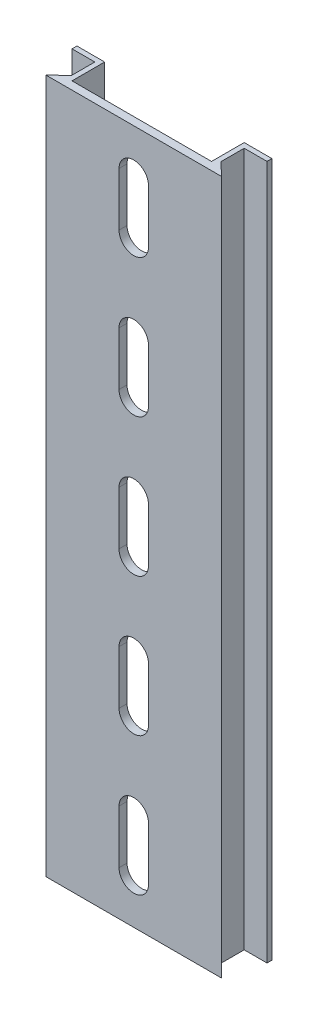
ISO-10303-21;
HEADER;
FILE_DESCRIPTION(('STEP AP214'),'2;1');
FILE_NAME('part.step','',(''),(''),'','','');
FILE_SCHEMA(('AUTOMOTIVE_DESIGN { 1 0 10303 214 1 1 1 1 }'));
ENDSEC;
DATA;
#1=APPLICATION_CONTEXT('core data for automotive mechanical design processes');
#2=APPLICATION_PROTOCOL_DEFINITION('international standard','automotive_design',2000,#1);
#3=PRODUCT_CONTEXT('',#1,'mechanical');
#4=PRODUCT('Part','Part','',(#3));
#5=PRODUCT_RELATED_PRODUCT_CATEGORY('part','',(#4));
#6=PRODUCT_DEFINITION_FORMATION('','',#4);
#7=PRODUCT_DEFINITION_CONTEXT('part definition',#1,'design');
#8=PRODUCT_DEFINITION('design','',#6,#7);
#9=PRODUCT_DEFINITION_SHAPE('','',#8);
#10=(LENGTH_UNIT() NAMED_UNIT(*) SI_UNIT(.MILLI.,.METRE.));
#11=(NAMED_UNIT(*) PLANE_ANGLE_UNIT() SI_UNIT($,.RADIAN.));
#12=(NAMED_UNIT(*) SI_UNIT($,.STERADIAN.) SOLID_ANGLE_UNIT());
#13=UNCERTAINTY_MEASURE_WITH_UNIT(LENGTH_MEASURE(1.E-05),#10,'distance_accuracy_value','');
#14=(GEOMETRIC_REPRESENTATION_CONTEXT(3) GLOBAL_UNCERTAINTY_ASSIGNED_CONTEXT((#13)) GLOBAL_UNIT_ASSIGNED_CONTEXT((#10,
#11,#12)) REPRESENTATION_CONTEXT('',''));
#15=CARTESIAN_POINT('',(0.,0.,0.));
#16=DIRECTION('',(0.,0.,1.));
#17=DIRECTION('',(1.,0.,0.));
#18=AXIS2_PLACEMENT_3D('',#15,#16,#17);
#19=CARTESIAN_POINT('',(0.,62.865,-1.4478));
#20=DIRECTION('',(0.,0.,-1.));
#21=DIRECTION('',(-1.,0.,0.));
#22=AXIS2_PLACEMENT_3D('',#19,#20,#21);
#23=PLANE('',#22);
#24=CARTESIAN_POINT('',(0.,20.167,-1.4478));
#25=DIRECTION('',(0.,0.,-1.));
#26=DIRECTION('',(-1.,0.,0.));
#27=AXIS2_PLACEMENT_3D('',#24,#25,#26);
#28=CIRCLE('',#27,2.667);
#29=CARTESIAN_POINT('',(2.66699999999991,20.167,-1.4478));
#30=VERTEX_POINT('',#29);
#31=CARTESIAN_POINT('',(-2.66700000000009,20.167,-1.4478));
#32=VERTEX_POINT('',#31);
#33=EDGE_CURVE('E372',#30,#32,#28,.T.);
#34=ORIENTED_EDGE('',*,*,#33,.F.);
#35=DIRECTION('',(0.,-1.,0.));
#36=VECTOR('',#35,1.);
#37=CARTESIAN_POINT('',(2.66699999999991,62.865,-1.4478));
#38=LINE('',#37,#36);
#39=CARTESIAN_POINT('',(2.66699999999991,29.833,-1.4478));
#40=VERTEX_POINT('',#39);
#41=EDGE_CURVE('E367',#40,#30,#38,.T.);
#42=ORIENTED_EDGE('',*,*,#41,.F.);
#43=CARTESIAN_POINT('',(0.,29.833,-1.4478));
#44=DIRECTION('',(0.,0.,-1.));
#45=DIRECTION('',(-1.,0.,0.));
#46=AXIS2_PLACEMENT_3D('',#43,#44,#45);
#47=CIRCLE('',#46,2.667);
#48=CARTESIAN_POINT('',(-2.66700000000009,29.833,-1.4478));
#49=VERTEX_POINT('',#48);
#50=EDGE_CURVE('E257',#49,#40,#47,.T.);
#51=ORIENTED_EDGE('',*,*,#50,.F.);
#52=DIRECTION('',(0.,1.,0.));
#53=VECTOR('',#52,1.);
#54=CARTESIAN_POINT('',(-2.66700000000009,62.865,-1.4478));
#55=LINE('',#54,#53);
#56=EDGE_CURVE('E370',#32,#49,#55,.T.);
#57=ORIENTED_EDGE('',*,*,#56,.F.);
#58=EDGE_LOOP('',(#34,#42,#51,#57));
#59=FACE_BOUND('',#58,.T.);
#60=CARTESIAN_POINT('',(-1.74574066942157E-13,45.167,-1.4478));
#61=DIRECTION('',(0.,0.,-1.));
#62=DIRECTION('',(-1.,0.,0.));
#63=AXIS2_PLACEMENT_3D('',#60,#61,#62);
#64=CIRCLE('',#63,2.667);
#65=CARTESIAN_POINT('',(2.66699999999982,45.167,-1.4478));
#66=VERTEX_POINT('',#65);
#67=CARTESIAN_POINT('',(-2.66700000000017,45.167,-1.4478));
#68=VERTEX_POINT('',#67);
#69=EDGE_CURVE('E365',#66,#68,#64,.T.);
#70=ORIENTED_EDGE('',*,*,#69,.F.);
#71=DIRECTION('',(0.,-1.,0.));
#72=VECTOR('',#71,1.);
#73=CARTESIAN_POINT('',(2.66699999999982,62.865,-1.4478));
#74=LINE('',#73,#72);
#75=CARTESIAN_POINT('',(2.66699999999982,54.833,-1.4478));
#76=VERTEX_POINT('',#75);
#77=EDGE_CURVE('E359',#76,#66,#74,.T.);
#78=ORIENTED_EDGE('',*,*,#77,.F.);
#79=CARTESIAN_POINT('',(-1.74574066942157E-13,54.833,-1.4478));
#80=DIRECTION('',(0.,0.,-1.));
#81=DIRECTION('',(-1.,0.,0.));
#82=AXIS2_PLACEMENT_3D('',#79,#80,#81);
#83=CIRCLE('',#82,2.667);
#84=CARTESIAN_POINT('',(-2.66700000000017,54.833,-1.4478));
#85=VERTEX_POINT('',#84);
#86=EDGE_CURVE('E361',#85,#76,#83,.T.);
#87=ORIENTED_EDGE('',*,*,#86,.F.);
#88=DIRECTION('',(0.,1.,0.));
#89=VECTOR('',#88,1.);
#90=CARTESIAN_POINT('',(-2.66700000000017,62.865,-1.4478));
#91=LINE('',#90,#89);
#92=EDGE_CURVE('E363',#68,#85,#91,.T.);
#93=ORIENTED_EDGE('',*,*,#92,.F.);
#94=EDGE_LOOP('',(#70,#78,#87,#93));
#95=FACE_BOUND('',#94,.T.);
#96=CARTESIAN_POINT('',(2.61861100413235E-13,-29.833,-1.4478));
#97=DIRECTION('',(0.,0.,-1.));
#98=DIRECTION('',(-1.,0.,0.));
#99=AXIS2_PLACEMENT_3D('',#96,#97,#98);
#100=CIRCLE('',#99,2.667);
#101=CARTESIAN_POINT('',(2.66700000000026,-29.833,-1.4478));
#102=VERTEX_POINT('',#101);
#103=CARTESIAN_POINT('',(-2.66699999999974,-29.833,-1.4478));
#104=VERTEX_POINT('',#103);
#105=EDGE_CURVE('E357',#102,#104,#100,.T.);
#106=ORIENTED_EDGE('',*,*,#105,.F.);
#107=DIRECTION('',(0.,-1.,0.));
#108=VECTOR('',#107,1.);
#109=CARTESIAN_POINT('',(2.66700000000026,62.865,-1.4478));
#110=LINE('',#109,#108);
#111=CARTESIAN_POINT('',(2.66700000000026,-20.167,-1.4478));
#112=VERTEX_POINT('',#111);
#113=EDGE_CURVE('E350',#112,#102,#110,.T.);
#114=ORIENTED_EDGE('',*,*,#113,.F.);
#115=CARTESIAN_POINT('',(2.61861100413235E-13,-20.167,-1.4478));
#116=DIRECTION('',(0.,0.,-1.));
#117=DIRECTION('',(-1.,0.,0.));
#118=AXIS2_PLACEMENT_3D('',#115,#116,#117);
#119=CIRCLE('',#118,2.667);
#120=CARTESIAN_POINT('',(-2.66699999999974,-20.167,-1.4478));
#121=VERTEX_POINT('',#120);
#122=EDGE_CURVE('E352',#121,#112,#119,.T.);
#123=ORIENTED_EDGE('',*,*,#122,.F.);
#124=DIRECTION('',(0.,1.,0.));
#125=VECTOR('',#124,1.);
#126=CARTESIAN_POINT('',(-2.66699999999974,62.865,-1.4478));
#127=LINE('',#126,#125);
#128=EDGE_CURVE('E355',#104,#121,#127,.T.);
#129=ORIENTED_EDGE('',*,*,#128,.F.);
#130=EDGE_LOOP('',(#106,#114,#123,#129));
#131=FACE_BOUND('',#130,.T.);
#132=CARTESIAN_POINT('',(5.2372220082647E-13,-54.833,-1.4478));
#133=DIRECTION('',(0.,0.,-1.));
#134=DIRECTION('',(-1.,0.,0.));
#135=AXIS2_PLACEMENT_3D('',#132,#133,#134);
#136=CIRCLE('',#135,2.667);
#137=CARTESIAN_POINT('',(2.66700000000052,-54.833,-1.4478));
#138=VERTEX_POINT('',#137);
#139=CARTESIAN_POINT('',(-2.66699999999948,-54.833,-1.4478));
#140=VERTEX_POINT('',#139);
#141=EDGE_CURVE('E348',#138,#140,#136,.T.);
#142=ORIENTED_EDGE('',*,*,#141,.F.);
#143=DIRECTION('',(0.,-1.,0.));
#144=VECTOR('',#143,1.);
#145=CARTESIAN_POINT('',(2.66700000000052,62.865,-1.4478));
#146=LINE('',#145,#144);
#147=CARTESIAN_POINT('',(2.66700000000052,-45.167,-1.4478));
#148=VERTEX_POINT('',#147);
#149=EDGE_CURVE('E281',#148,#138,#146,.T.);
#150=ORIENTED_EDGE('',*,*,#149,.F.);
#151=CARTESIAN_POINT('',(5.2372220082647E-13,-45.167,-1.4478));
#152=DIRECTION('',(0.,0.,-1.));
#153=DIRECTION('',(-1.,0.,0.));
#154=AXIS2_PLACEMENT_3D('',#151,#152,#153);
#155=CIRCLE('',#154,2.667);
#156=CARTESIAN_POINT('',(-2.66699999999948,-45.167,-1.4478));
#157=VERTEX_POINT('',#156);
#158=EDGE_CURVE('E343',#157,#148,#155,.T.);
#159=ORIENTED_EDGE('',*,*,#158,.F.);
#160=DIRECTION('',(0.,1.,0.));
#161=VECTOR('',#160,1.);
#162=CARTESIAN_POINT('',(-2.66699999999948,62.865,-1.4478));
#163=LINE('',#162,#161);
#164=EDGE_CURVE('E346',#140,#157,#163,.T.);
#165=ORIENTED_EDGE('',*,*,#164,.F.);
#166=EDGE_LOOP('',(#142,#150,#159,#165));
#167=FACE_BOUND('',#166,.T.);
#168=CARTESIAN_POINT('',(0.,-4.833,-1.4478));
#169=DIRECTION('',(0.,0.,-1.));
#170=DIRECTION('',(-1.,0.,0.));
#171=AXIS2_PLACEMENT_3D('',#168,#169,#170);
#172=CIRCLE('',#171,2.667);
#173=CARTESIAN_POINT('',(2.667,-4.833,-1.4478));
#174=VERTEX_POINT('',#173);
#175=CARTESIAN_POINT('',(-2.667,-4.833,-1.4478));
#176=VERTEX_POINT('',#175);
#177=EDGE_CURVE('E401',#174,#176,#172,.T.);
#178=ORIENTED_EDGE('',*,*,#177,.F.);
#179=DIRECTION('',(0.,-1.,0.));
#180=VECTOR('',#179,1.);
#181=CARTESIAN_POINT('',(2.667,62.865,-1.4478));
#182=LINE('',#181,#180);
#183=CARTESIAN_POINT('',(2.667,4.833,-1.4478));
#184=VERTEX_POINT('',#183);
#185=EDGE_CURVE('E388',#184,#174,#182,.T.);
#186=ORIENTED_EDGE('',*,*,#185,.F.);
#187=CARTESIAN_POINT('',(0.,4.833,-1.4478));
#188=DIRECTION('',(0.,0.,-1.));
#189=DIRECTION('',(-1.,0.,0.));
#190=AXIS2_PLACEMENT_3D('',#187,#188,#189);
#191=CIRCLE('',#190,2.667);
#192=CARTESIAN_POINT('',(-2.667,4.833,-1.4478));
#193=VERTEX_POINT('',#192);
#194=EDGE_CURVE('E396',#193,#184,#191,.T.);
#195=ORIENTED_EDGE('',*,*,#194,.F.);
#196=DIRECTION('',(0.,1.,0.));
#197=VECTOR('',#196,1.);
#198=CARTESIAN_POINT('',(-2.667,62.865,-1.4478));
#199=LINE('',#198,#197);
#200=EDGE_CURVE('E399',#176,#193,#199,.T.);
#201=ORIENTED_EDGE('',*,*,#200,.F.);
#202=EDGE_LOOP('',(#178,#186,#195,#201));
#203=FACE_BOUND('',#202,.T.);
#204=DIRECTION('',(1.,0.,0.));
#205=VECTOR('',#204,1.);
#206=CARTESIAN_POINT('',(0.,-62.865,-1.4478));
#207=LINE('',#206,#205);
#208=CARTESIAN_POINT('',(-12.6365,-62.865,-1.4478));
#209=VERTEX_POINT('',#208);
#210=CARTESIAN_POINT('',(12.6365,-62.865,-1.4478));
#211=VERTEX_POINT('',#210);
#212=EDGE_CURVE('E403',#209,#211,#207,.T.);
#213=ORIENTED_EDGE('',*,*,#212,.F.);
#214=DIRECTION('',(0.,-1.,0.));
#215=VECTOR('',#214,1.);
#216=CARTESIAN_POINT('',(-12.6365,62.865,-1.4478));
#217=LINE('',#216,#215);
#218=CARTESIAN_POINT('',(-12.6365,62.865,-1.4478));
#219=VERTEX_POINT('',#218);
#220=EDGE_CURVE('E11',#219,#209,#217,.T.);
#221=ORIENTED_EDGE('',*,*,#220,.F.);
#222=DIRECTION('',(1.,0.,0.));
#223=VECTOR('',#222,1.);
#224=CARTESIAN_POINT('',(0.,62.865,-1.4478));
#225=LINE('',#224,#223);
#226=CARTESIAN_POINT('',(12.6365,62.865,-1.4478));
#227=VERTEX_POINT('',#226);
#228=EDGE_CURVE('E404',#219,#227,#225,.T.);
#229=ORIENTED_EDGE('',*,*,#228,.T.);
#230=DIRECTION('',(0.,-1.,0.));
#231=VECTOR('',#230,1.);
#232=CARTESIAN_POINT('',(12.6365,62.865,-1.4478));
#233=LINE('',#232,#231);
#234=EDGE_CURVE('E441',#227,#211,#233,.T.);
#235=ORIENTED_EDGE('',*,*,#234,.T.);
#236=EDGE_LOOP('',(#213,#221,#229,#235));
#237=FACE_BOUND('',#236,.T.);
#238=ADVANCED_FACE('F33',(#59,#95,#131,#167,#203,#237),#23,.T.);
#239=CARTESIAN_POINT('',(-12.6365,62.865,0.));
#240=DIRECTION('',(-1.,0.,0.));
#241=DIRECTION('',(0.,0.,1.));
#242=AXIS2_PLACEMENT_3D('',#239,#240,#241);
#243=PLANE('',#242);
#244=DIRECTION('',(0.,0.,-1.));
#245=VECTOR('',#244,1.);
#246=CARTESIAN_POINT('',(-12.6365,-62.865,0.));
#247=LINE('',#246,#245);
#248=CARTESIAN_POINT('',(-12.6365,-62.865,-7.366));
#249=VERTEX_POINT('',#248);
#250=EDGE_CURVE('E444',#209,#249,#247,.T.);
#251=ORIENTED_EDGE('',*,*,#250,.T.);
#252=DIRECTION('',(0.,-1.,0.));
#253=VECTOR('',#252,1.);
#254=CARTESIAN_POINT('',(-12.6365,62.865,-7.366));
#255=LINE('',#254,#253);
#256=CARTESIAN_POINT('',(-12.6365,62.865,-7.366));
#257=VERTEX_POINT('',#256);
#258=EDGE_CURVE('E40',#257,#249,#255,.T.);
#259=ORIENTED_EDGE('',*,*,#258,.F.);
#260=DIRECTION('',(0.,0.,-1.));
#261=VECTOR('',#260,1.);
#262=CARTESIAN_POINT('',(-12.6365,62.865,0.));
#263=LINE('',#262,#261);
#264=EDGE_CURVE('E407',#219,#257,#263,.T.);
#265=ORIENTED_EDGE('',*,*,#264,.F.);
#266=ORIENTED_EDGE('',*,*,#220,.T.);
#267=EDGE_LOOP('',(#251,#259,#265,#266));
#268=FACE_BOUND('',#267,.T.);
#269=ADVANCED_FACE('F533',(#268),#243,.F.);
#270=CARTESIAN_POINT('',(0.,62.865,-7.366));
#271=DIRECTION('',(0.,0.,1.));
#272=DIRECTION('',(1.,0.,0.));
#273=AXIS2_PLACEMENT_3D('',#270,#271,#272);
#274=PLANE('',#273);
#275=DIRECTION('',(-1.,0.,0.));
#276=VECTOR('',#275,1.);
#277=CARTESIAN_POINT('',(0.,-62.865,-7.366));
#278=LINE('',#277,#276);
#279=CARTESIAN_POINT('',(-17.653,-62.865,-7.366));
#280=VERTEX_POINT('',#279);
#281=EDGE_CURVE('E446',#249,#280,#278,.T.);
#282=ORIENTED_EDGE('',*,*,#281,.T.);
#283=DIRECTION('',(0.,-1.,0.));
#284=VECTOR('',#283,1.);
#285=CARTESIAN_POINT('',(-17.653,62.865,-7.366));
#286=LINE('',#285,#284);
#287=CARTESIAN_POINT('',(-17.653,62.865,-7.366));
#288=VERTEX_POINT('',#287);
#289=EDGE_CURVE('E501',#288,#280,#286,.T.);
#290=ORIENTED_EDGE('',*,*,#289,.F.);
#291=DIRECTION('',(-1.,0.,0.));
#292=VECTOR('',#291,1.);
#293=CARTESIAN_POINT('',(0.,62.865,-7.366));
#294=LINE('',#293,#292);
#295=EDGE_CURVE('E410',#257,#288,#294,.T.);
#296=ORIENTED_EDGE('',*,*,#295,.F.);
#297=ORIENTED_EDGE('',*,*,#258,.T.);
#298=EDGE_LOOP('',(#282,#290,#296,#297));
#299=FACE_BOUND('',#298,.T.);
#300=ADVANCED_FACE('F508',(#299),#274,.F.);
#301=CARTESIAN_POINT('',(-17.653,62.865,0.));
#302=DIRECTION('',(1.,0.,0.));
#303=DIRECTION('',(0.,0.,-1.));
#304=AXIS2_PLACEMENT_3D('',#301,#302,#303);
#305=PLANE('',#304);
#306=DIRECTION('',(0.,0.,1.));
#307=VECTOR('',#306,1.);
#308=CARTESIAN_POINT('',(-17.653,-62.865,0.));
#309=LINE('',#308,#307);
#310=CARTESIAN_POINT('',(-17.653,-62.865,-6.477));
#311=VERTEX_POINT('',#310);
#312=EDGE_CURVE('E448',#280,#311,#309,.T.);
#313=ORIENTED_EDGE('',*,*,#312,.T.);
#314=DIRECTION('',(0.,-1.,0.));
#315=VECTOR('',#314,1.);
#316=CARTESIAN_POINT('',(-17.653,62.865,-6.477));
#317=LINE('',#316,#315);
#318=CARTESIAN_POINT('',(-17.653,62.865,-6.477));
#319=VERTEX_POINT('',#318);
#320=EDGE_CURVE('E498',#319,#311,#317,.T.);
#321=ORIENTED_EDGE('',*,*,#320,.F.);
#322=DIRECTION('',(0.,0.,1.));
#323=VECTOR('',#322,1.);
#324=CARTESIAN_POINT('',(-17.653,62.865,0.));
#325=LINE('',#324,#323);
#326=EDGE_CURVE('E412',#288,#319,#325,.T.);
#327=ORIENTED_EDGE('',*,*,#326,.F.);
#328=ORIENTED_EDGE('',*,*,#289,.T.);
#329=EDGE_LOOP('',(#313,#321,#327,#328));
#330=FACE_BOUND('',#329,.T.);
#331=ADVANCED_FACE('F521',(#330),#305,.F.);
#332=CARTESIAN_POINT('',(0.,62.865,-6.477));
#333=DIRECTION('',(0.,0.,-1.));
#334=DIRECTION('',(-1.,0.,0.));
#335=AXIS2_PLACEMENT_3D('',#332,#333,#334);
#336=PLANE('',#335);
#337=DIRECTION('',(1.,0.,0.));
#338=VECTOR('',#337,1.);
#339=CARTESIAN_POINT('',(0.,-62.865,-6.477));
#340=LINE('',#339,#338);
#341=CARTESIAN_POINT('',(-13.5255,-62.865,-6.477));
#342=VERTEX_POINT('',#341);
#343=EDGE_CURVE('E450',#311,#342,#340,.T.);
#344=ORIENTED_EDGE('',*,*,#343,.T.);
#345=DIRECTION('',(0.,-1.,0.));
#346=VECTOR('',#345,1.);
#347=CARTESIAN_POINT('',(-13.5255,62.865,-6.477));
#348=LINE('',#347,#346);
#349=CARTESIAN_POINT('',(-13.5255,62.865,-6.477));
#350=VERTEX_POINT('',#349);
#351=EDGE_CURVE('E495',#350,#342,#348,.T.);
#352=ORIENTED_EDGE('',*,*,#351,.F.);
#353=DIRECTION('',(1.,0.,0.));
#354=VECTOR('',#353,1.);
#355=CARTESIAN_POINT('',(0.,62.865,-6.477));
#356=LINE('',#355,#354);
#357=EDGE_CURVE('E414',#319,#350,#356,.T.);
#358=ORIENTED_EDGE('',*,*,#357,.F.);
#359=ORIENTED_EDGE('',*,*,#320,.T.);
#360=EDGE_LOOP('',(#344,#352,#358,#359));
#361=FACE_BOUND('',#360,.T.);
#362=ADVANCED_FACE('F525',(#361),#336,.F.);
#363=CARTESIAN_POINT('',(-13.5255,62.865,0.));
#364=DIRECTION('',(1.,0.,0.));
#365=DIRECTION('',(0.,0.,-1.));
#366=AXIS2_PLACEMENT_3D('',#363,#364,#365);
#367=PLANE('',#366);
#368=DIRECTION('',(0.,0.,1.));
#369=VECTOR('',#368,1.);
#370=CARTESIAN_POINT('',(-13.5255,-62.865,0.));
#371=LINE('',#370,#369);
#372=CARTESIAN_POINT('',(-13.5255,-62.865,-2.286));
#373=VERTEX_POINT('',#372);
#374=EDGE_CURVE('E452',#342,#373,#371,.T.);
#375=ORIENTED_EDGE('',*,*,#374,.T.);
#376=DIRECTION('',(0.,-1.,0.));
#377=VECTOR('',#376,1.);
#378=CARTESIAN_POINT('',(-13.5255,62.865,-2.286));
#379=LINE('',#378,#377);
#380=CARTESIAN_POINT('',(-13.5255,62.865,-2.286));
#381=VERTEX_POINT('',#380);
#382=EDGE_CURVE('E492',#381,#373,#379,.T.);
#383=ORIENTED_EDGE('',*,*,#382,.F.);
#384=DIRECTION('',(0.,0.,1.));
#385=VECTOR('',#384,1.);
#386=CARTESIAN_POINT('',(-13.5255,62.865,0.));
#387=LINE('',#386,#385);
#388=EDGE_CURVE('E416',#350,#381,#387,.T.);
#389=ORIENTED_EDGE('',*,*,#388,.F.);
#390=ORIENTED_EDGE('',*,*,#351,.T.);
#391=EDGE_LOOP('',(#375,#383,#389,#390));
#392=FACE_BOUND('',#391,.T.);
#393=ADVANCED_FACE('F567',(#392),#367,.F.);
#394=CARTESIAN_POINT('',(-7.72007504690431,62.865,-7.93452157598499));
#395=DIRECTION('',(0.697354959803454,0.,0.716725930909106));
#396=DIRECTION('',(0.716725930909106,0.,-0.697354959803454));
#397=AXIS2_PLACEMENT_3D('',#394,#395,#396);
#398=PLANE('',#397);
#399=DIRECTION('',(-0.716725930909106,0.,0.697354959803454));
#400=VECTOR('',#399,1.);
#401=CARTESIAN_POINT('',(-7.72007504690431,-62.865,-7.93452157598499));
#402=LINE('',#401,#400);
#403=CARTESIAN_POINT('',(-15.875,-62.865,0.));
#404=VERTEX_POINT('',#403);
#405=EDGE_CURVE('E454',#373,#404,#402,.T.);
#406=ORIENTED_EDGE('',*,*,#405,.T.);
#407=DIRECTION('',(0.,-1.,0.));
#408=VECTOR('',#407,1.);
#409=CARTESIAN_POINT('',(-15.875,62.865,0.));
#410=LINE('',#409,#408);
#411=CARTESIAN_POINT('',(-15.875,62.865,0.));
#412=VERTEX_POINT('',#411);
#413=EDGE_CURVE('E490',#412,#404,#410,.T.);
#414=ORIENTED_EDGE('',*,*,#413,.F.);
#415=DIRECTION('',(-0.716725930909106,0.,0.697354959803454));
#416=VECTOR('',#415,1.);
#417=CARTESIAN_POINT('',(-7.72007504690431,62.865,-7.93452157598499));
#418=LINE('',#417,#416);
#419=EDGE_CURVE('E418',#381,#412,#418,.T.);
#420=ORIENTED_EDGE('',*,*,#419,.F.);
#421=ORIENTED_EDGE('',*,*,#382,.T.);
#422=EDGE_LOOP('',(#406,#414,#420,#421));
#423=FACE_BOUND('',#422,.T.);
#424=ADVANCED_FACE('F565',(#423),#398,.F.);
#425=CARTESIAN_POINT('',(0.,62.865,0.));
#426=DIRECTION('',(0.,0.,1.));
#427=DIRECTION('',(1.,0.,0.));
#428=AXIS2_PLACEMENT_3D('',#425,#426,#427);
#429=PLANE('',#428);
#430=CARTESIAN_POINT('',(0.,20.167,0.));
#431=DIRECTION('',(0.,0.,1.));
#432=DIRECTION('',(1.,0.,0.));
#433=AXIS2_PLACEMENT_3D('',#430,#431,#432);
#434=CIRCLE('',#433,2.667);
#435=CARTESIAN_POINT('',(-2.66700000000009,20.167,0.));
#436=VERTEX_POINT('',#435);
#437=CARTESIAN_POINT('',(2.66699999999991,20.167,0.));
#438=VERTEX_POINT('',#437);
#439=EDGE_CURVE('E269',#436,#438,#434,.T.);
#440=ORIENTED_EDGE('',*,*,#439,.F.);
#441=DIRECTION('',(0.,-1.,0.));
#442=VECTOR('',#441,1.);
#443=CARTESIAN_POINT('',(-2.66700000000009,20.167,0.));
#444=LINE('',#443,#442);
#445=CARTESIAN_POINT('',(-2.66700000000009,29.833,0.));
#446=VERTEX_POINT('',#445);
#447=EDGE_CURVE('E274',#446,#436,#444,.T.);
#448=ORIENTED_EDGE('',*,*,#447,.F.);
#449=CARTESIAN_POINT('',(0.,29.833,0.));
#450=DIRECTION('',(0.,0.,1.));
#451=DIRECTION('',(1.,0.,0.));
#452=AXIS2_PLACEMENT_3D('',#449,#450,#451);
#453=CIRCLE('',#452,2.667);
#454=CARTESIAN_POINT('',(2.66699999999991,29.833,0.));
#455=VERTEX_POINT('',#454);
#456=EDGE_CURVE('E254',#455,#446,#453,.T.);
#457=ORIENTED_EDGE('',*,*,#456,.F.);
#458=DIRECTION('',(0.,1.,0.));
#459=VECTOR('',#458,1.);
#460=CARTESIAN_POINT('',(2.66699999999991,20.167,0.));
#461=LINE('',#460,#459);
#462=EDGE_CURVE('E264',#438,#455,#461,.T.);
#463=ORIENTED_EDGE('',*,*,#462,.F.);
#464=EDGE_LOOP('',(#440,#448,#457,#463));
#465=FACE_BOUND('',#464,.T.);
#466=CARTESIAN_POINT('',(-1.74574066942157E-13,45.167,0.));
#467=DIRECTION('',(0.,0.,1.));
#468=DIRECTION('',(1.,0.,0.));
#469=AXIS2_PLACEMENT_3D('',#466,#467,#468);
#470=CIRCLE('',#469,2.667);
#471=CARTESIAN_POINT('',(-2.66700000000017,45.167,0.));
#472=VERTEX_POINT('',#471);
#473=CARTESIAN_POINT('',(2.66699999999982,45.167,0.));
#474=VERTEX_POINT('',#473);
#475=EDGE_CURVE('E284',#472,#474,#470,.T.);
#476=ORIENTED_EDGE('',*,*,#475,.F.);
#477=DIRECTION('',(0.,-1.,0.));
#478=VECTOR('',#477,1.);
#479=CARTESIAN_POINT('',(-2.66700000000017,45.167,0.));
#480=LINE('',#479,#478);
#481=CARTESIAN_POINT('',(-2.66700000000017,54.833,0.));
#482=VERTEX_POINT('',#481);
#483=EDGE_CURVE('E292',#482,#472,#480,.T.);
#484=ORIENTED_EDGE('',*,*,#483,.F.);
#485=CARTESIAN_POINT('',(-1.74574066942157E-13,54.833,0.));
#486=DIRECTION('',(0.,0.,1.));
#487=DIRECTION('',(1.,0.,0.));
#488=AXIS2_PLACEMENT_3D('',#485,#486,#487);
#489=CIRCLE('',#488,2.667);
#490=CARTESIAN_POINT('',(2.66699999999982,54.833,0.));
#491=VERTEX_POINT('',#490);
#492=EDGE_CURVE('E289',#491,#482,#489,.T.);
#493=ORIENTED_EDGE('',*,*,#492,.F.);
#494=DIRECTION('',(0.,1.,0.));
#495=VECTOR('',#494,1.);
#496=CARTESIAN_POINT('',(2.66699999999982,45.167,0.));
#497=LINE('',#496,#495);
#498=EDGE_CURVE('E286',#474,#491,#497,.T.);
#499=ORIENTED_EDGE('',*,*,#498,.F.);
#500=EDGE_LOOP('',(#476,#484,#493,#499));
#501=FACE_BOUND('',#500,.T.);
#502=CARTESIAN_POINT('',(2.61861100413235E-13,-29.833,0.));
#503=DIRECTION('',(0.,0.,1.));
#504=DIRECTION('',(1.,0.,0.));
#505=AXIS2_PLACEMENT_3D('',#502,#503,#504);
#506=CIRCLE('',#505,2.667);
#507=CARTESIAN_POINT('',(-2.66699999999974,-29.833,0.));
#508=VERTEX_POINT('',#507);
#509=CARTESIAN_POINT('',(2.66700000000026,-29.833,0.));
#510=VERTEX_POINT('',#509);
#511=EDGE_CURVE('E303',#508,#510,#506,.T.);
#512=ORIENTED_EDGE('',*,*,#511,.F.);
#513=DIRECTION('',(0.,-1.,0.));
#514=VECTOR('',#513,1.);
#515=CARTESIAN_POINT('',(-2.66699999999974,-29.833,0.));
#516=LINE('',#515,#514);
#517=CARTESIAN_POINT('',(-2.66699999999974,-20.167,0.));
#518=VERTEX_POINT('',#517);
#519=EDGE_CURVE('E312',#518,#508,#516,.T.);
#520=ORIENTED_EDGE('',*,*,#519,.F.);
#521=CARTESIAN_POINT('',(2.61861100413235E-13,-20.167,0.));
#522=DIRECTION('',(0.,0.,1.));
#523=DIRECTION('',(1.,0.,0.));
#524=AXIS2_PLACEMENT_3D('',#521,#522,#523);
#525=CIRCLE('',#524,2.667);
#526=CARTESIAN_POINT('',(2.66700000000026,-20.167,0.));
#527=VERTEX_POINT('',#526);
#528=EDGE_CURVE('E309',#527,#518,#525,.T.);
#529=ORIENTED_EDGE('',*,*,#528,.F.);
#530=DIRECTION('',(0.,1.,0.));
#531=VECTOR('',#530,1.);
#532=CARTESIAN_POINT('',(2.66700000000026,-29.833,0.));
#533=LINE('',#532,#531);
#534=EDGE_CURVE('E305',#510,#527,#533,.T.);
#535=ORIENTED_EDGE('',*,*,#534,.F.);
#536=EDGE_LOOP('',(#512,#520,#529,#535));
#537=FACE_BOUND('',#536,.T.);
#538=CARTESIAN_POINT('',(5.2372220082647E-13,-54.833,0.));
#539=DIRECTION('',(0.,0.,1.));
#540=DIRECTION('',(1.,0.,0.));
#541=AXIS2_PLACEMENT_3D('',#538,#539,#540);
#542=CIRCLE('',#541,2.667);
#543=CARTESIAN_POINT('',(-2.66699999999948,-54.833,0.));
#544=VERTEX_POINT('',#543);
#545=CARTESIAN_POINT('',(2.66700000000052,-54.833,0.));
#546=VERTEX_POINT('',#545);
#547=EDGE_CURVE('E323',#544,#546,#542,.T.);
#548=ORIENTED_EDGE('',*,*,#547,.F.);
#549=DIRECTION('',(0.,-1.,0.));
#550=VECTOR('',#549,1.);
#551=CARTESIAN_POINT('',(-2.66699999999948,-54.833,0.));
#552=LINE('',#551,#550);
#553=CARTESIAN_POINT('',(-2.66699999999948,-45.167,0.));
#554=VERTEX_POINT('',#553);
#555=EDGE_CURVE('E331',#554,#544,#552,.T.);
#556=ORIENTED_EDGE('',*,*,#555,.F.);
#557=CARTESIAN_POINT('',(5.2372220082647E-13,-45.167,0.));
#558=DIRECTION('',(0.,0.,1.));
#559=DIRECTION('',(1.,0.,0.));
#560=AXIS2_PLACEMENT_3D('',#557,#558,#559);
#561=CIRCLE('',#560,2.667);
#562=CARTESIAN_POINT('',(2.66700000000052,-45.167,0.));
#563=VERTEX_POINT('',#562);
#564=EDGE_CURVE('E328',#563,#554,#561,.T.);
#565=ORIENTED_EDGE('',*,*,#564,.F.);
#566=DIRECTION('',(0.,1.,0.));
#567=VECTOR('',#566,1.);
#568=CARTESIAN_POINT('',(2.66700000000052,-54.833,0.));
#569=LINE('',#568,#567);
#570=EDGE_CURVE('E325',#546,#563,#569,.T.);
#571=ORIENTED_EDGE('',*,*,#570,.F.);
#572=EDGE_LOOP('',(#548,#556,#565,#571));
#573=FACE_BOUND('',#572,.T.);
#574=CARTESIAN_POINT('',(0.,-4.833,0.));
#575=DIRECTION('',(0.,0.,1.));
#576=DIRECTION('',(1.,0.,0.));
#577=AXIS2_PLACEMENT_3D('',#574,#575,#576);
#578=CIRCLE('',#577,2.667);
#579=CARTESIAN_POINT('',(-2.667,-4.833,0.));
#580=VERTEX_POINT('',#579);
#581=CARTESIAN_POINT('',(2.667,-4.833,0.));
#582=VERTEX_POINT('',#581);
#583=EDGE_CURVE('E374',#580,#582,#578,.T.);
#584=ORIENTED_EDGE('',*,*,#583,.F.);
#585=DIRECTION('',(0.,-1.,0.));
#586=VECTOR('',#585,1.);
#587=CARTESIAN_POINT('',(-2.667,-4.833,0.));
#588=LINE('',#587,#586);
#589=CARTESIAN_POINT('',(-2.667,4.833,0.));
#590=VERTEX_POINT('',#589);
#591=EDGE_CURVE('E382',#590,#580,#588,.T.);
#592=ORIENTED_EDGE('',*,*,#591,.F.);
#593=CARTESIAN_POINT('',(0.,4.833,0.));
#594=DIRECTION('',(0.,0.,1.));
#595=DIRECTION('',(1.,0.,0.));
#596=AXIS2_PLACEMENT_3D('',#593,#594,#595);
#597=CIRCLE('',#596,2.667);
#598=CARTESIAN_POINT('',(2.667,4.833,0.));
#599=VERTEX_POINT('',#598);
#600=EDGE_CURVE('E379',#599,#590,#597,.T.);
#601=ORIENTED_EDGE('',*,*,#600,.F.);
#602=DIRECTION('',(0.,1.,0.));
#603=VECTOR('',#602,1.);
#604=CARTESIAN_POINT('',(2.667,-4.833,0.));
#605=LINE('',#604,#603);
#606=EDGE_CURVE('E376',#582,#599,#605,.T.);
#607=ORIENTED_EDGE('',*,*,#606,.F.);
#608=EDGE_LOOP('',(#584,#592,#601,#607));
#609=FACE_BOUND('',#608,.T.);
#610=DIRECTION('',(-1.,0.,0.));
#611=VECTOR('',#610,1.);
#612=CARTESIAN_POINT('',(0.,-62.865,0.));
#613=LINE('',#612,#611);
#614=CARTESIAN_POINT('',(15.875,-62.865,0.));
#615=VERTEX_POINT('',#614);
#616=EDGE_CURVE('E457',#615,#404,#613,.T.);
#617=ORIENTED_EDGE('',*,*,#616,.F.);
#618=DIRECTION('',(0.,-1.,0.));
#619=VECTOR('',#618,1.);
#620=CARTESIAN_POINT('',(15.875,62.865,0.));
#621=LINE('',#620,#619);
#622=CARTESIAN_POINT('',(15.875,62.865,0.));
#623=VERTEX_POINT('',#622);
#624=EDGE_CURVE('E488',#623,#615,#621,.T.);
#625=ORIENTED_EDGE('',*,*,#624,.F.);
#626=DIRECTION('',(-1.,0.,0.));
#627=VECTOR('',#626,1.);
#628=CARTESIAN_POINT('',(0.,62.865,0.));
#629=LINE('',#628,#627);
#630=EDGE_CURVE('E420',#623,#412,#629,.T.);
#631=ORIENTED_EDGE('',*,*,#630,.T.);
#632=ORIENTED_EDGE('',*,*,#413,.T.);
#633=EDGE_LOOP('',(#617,#625,#631,#632));
#634=FACE_BOUND('',#633,.T.);
#635=ADVANCED_FACE('F271',(#465,#501,#537,#573,#609,#634),#429,.T.);
#636=CARTESIAN_POINT('',(7.72007504690431,62.865,-7.93452157598499));
#637=DIRECTION('',(0.697354959803454,0.,-0.716725930909106));
#638=DIRECTION('',(-0.716725930909106,0.,-0.697354959803454));
#639=AXIS2_PLACEMENT_3D('',#636,#637,#638);
#640=PLANE('',#639);
#641=DIRECTION('',(0.716725930909106,0.,0.697354959803454));
#642=VECTOR('',#641,1.);
#643=CARTESIAN_POINT('',(7.72007504690431,-62.865,-7.93452157598499));
#644=LINE('',#643,#642);
#645=CARTESIAN_POINT('',(13.5255,-62.865,-2.286));
#646=VERTEX_POINT('',#645);
#647=EDGE_CURVE('E460',#646,#615,#644,.T.);
#648=ORIENTED_EDGE('',*,*,#647,.F.);
#649=DIRECTION('',(0.,-1.,0.));
#650=VECTOR('',#649,1.);
#651=CARTESIAN_POINT('',(13.5255,62.865,-2.286));
#652=LINE('',#651,#650);
#653=CARTESIAN_POINT('',(13.5255,62.865,-2.286));
#654=VERTEX_POINT('',#653);
#655=EDGE_CURVE('E486',#654,#646,#652,.T.);
#656=ORIENTED_EDGE('',*,*,#655,.F.);
#657=DIRECTION('',(0.716725930909106,0.,0.697354959803454));
#658=VECTOR('',#657,1.);
#659=CARTESIAN_POINT('',(7.72007504690431,62.865,-7.93452157598499));
#660=LINE('',#659,#658);
#661=EDGE_CURVE('E423',#654,#623,#660,.T.);
#662=ORIENTED_EDGE('',*,*,#661,.T.);
#663=ORIENTED_EDGE('',*,*,#624,.T.);
#664=EDGE_LOOP('',(#648,#656,#662,#663));
#665=FACE_BOUND('',#664,.T.);
#666=ADVANCED_FACE('F558',(#665),#640,.T.);
#667=CARTESIAN_POINT('',(13.5255,62.865,0.));
#668=DIRECTION('',(1.,0.,0.));
#669=DIRECTION('',(0.,0.,-1.));
#670=AXIS2_PLACEMENT_3D('',#667,#668,#669);
#671=PLANE('',#670);
#672=DIRECTION('',(0.,0.,1.));
#673=VECTOR('',#672,1.);
#674=CARTESIAN_POINT('',(13.5255,-62.865,0.));
#675=LINE('',#674,#673);
#676=CARTESIAN_POINT('',(13.5255,-62.865,-6.477));
#677=VERTEX_POINT('',#676);
#678=EDGE_CURVE('E463',#677,#646,#675,.T.);
#679=ORIENTED_EDGE('',*,*,#678,.F.);
#680=DIRECTION('',(0.,-1.,0.));
#681=VECTOR('',#680,1.);
#682=CARTESIAN_POINT('',(13.5255,62.865,-6.477));
#683=LINE('',#682,#681);
#684=CARTESIAN_POINT('',(13.5255,62.865,-6.477));
#685=VERTEX_POINT('',#684);
#686=EDGE_CURVE('E484',#685,#677,#683,.T.);
#687=ORIENTED_EDGE('',*,*,#686,.F.);
#688=DIRECTION('',(0.,0.,1.));
#689=VECTOR('',#688,1.);
#690=CARTESIAN_POINT('',(13.5255,62.865,0.));
#691=LINE('',#690,#689);
#692=EDGE_CURVE('E426',#685,#654,#691,.T.);
#693=ORIENTED_EDGE('',*,*,#692,.T.);
#694=ORIENTED_EDGE('',*,*,#655,.T.);
#695=EDGE_LOOP('',(#679,#687,#693,#694));
#696=FACE_BOUND('',#695,.T.);
#697=ADVANCED_FACE('F553',(#696),#671,.T.);
#698=CARTESIAN_POINT('',(0.,62.865,-6.477));
#699=DIRECTION('',(0.,0.,1.));
#700=DIRECTION('',(1.,0.,0.));
#701=AXIS2_PLACEMENT_3D('',#698,#699,#700);
#702=PLANE('',#701);
#703=DIRECTION('',(-1.,0.,0.));
#704=VECTOR('',#703,1.);
#705=CARTESIAN_POINT('',(0.,-62.865,-6.477));
#706=LINE('',#705,#704);
#707=CARTESIAN_POINT('',(17.653,-62.865,-6.477));
#708=VERTEX_POINT('',#707);
#709=EDGE_CURVE('E466',#708,#677,#706,.T.);
#710=ORIENTED_EDGE('',*,*,#709,.F.);
#711=DIRECTION('',(0.,-1.,0.));
#712=VECTOR('',#711,1.);
#713=CARTESIAN_POINT('',(17.653,62.865,-6.477));
#714=LINE('',#713,#712);
#715=CARTESIAN_POINT('',(17.653,62.865,-6.477));
#716=VERTEX_POINT('',#715);
#717=EDGE_CURVE('E482',#716,#708,#714,.T.);
#718=ORIENTED_EDGE('',*,*,#717,.F.);
#719=DIRECTION('',(-1.,0.,0.));
#720=VECTOR('',#719,1.);
#721=CARTESIAN_POINT('',(0.,62.865,-6.477));
#722=LINE('',#721,#720);
#723=EDGE_CURVE('E429',#716,#685,#722,.T.);
#724=ORIENTED_EDGE('',*,*,#723,.T.);
#725=ORIENTED_EDGE('',*,*,#686,.T.);
#726=EDGE_LOOP('',(#710,#718,#724,#725));
#727=FACE_BOUND('',#726,.T.);
#728=ADVANCED_FACE('F549',(#727),#702,.T.);
#729=CARTESIAN_POINT('',(17.653,62.865,0.));
#730=DIRECTION('',(1.,0.,0.));
#731=DIRECTION('',(0.,0.,-1.));
#732=AXIS2_PLACEMENT_3D('',#729,#730,#731);
#733=PLANE('',#732);
#734=DIRECTION('',(0.,0.,1.));
#735=VECTOR('',#734,1.);
#736=CARTESIAN_POINT('',(17.653,-62.865,0.));
#737=LINE('',#736,#735);
#738=CARTESIAN_POINT('',(17.653,-62.865,-7.366));
#739=VERTEX_POINT('',#738);
#740=EDGE_CURVE('E469',#739,#708,#737,.T.);
#741=ORIENTED_EDGE('',*,*,#740,.F.);
#742=DIRECTION('',(0.,-1.,0.));
#743=VECTOR('',#742,1.);
#744=CARTESIAN_POINT('',(17.653,62.865,-7.366));
#745=LINE('',#744,#743);
#746=CARTESIAN_POINT('',(17.653,62.865,-7.366));
#747=VERTEX_POINT('',#746);
#748=EDGE_CURVE('E480',#747,#739,#745,.T.);
#749=ORIENTED_EDGE('',*,*,#748,.F.);
#750=DIRECTION('',(0.,0.,1.));
#751=VECTOR('',#750,1.);
#752=CARTESIAN_POINT('',(17.653,62.865,0.));
#753=LINE('',#752,#751);
#754=EDGE_CURVE('E432',#747,#716,#753,.T.);
#755=ORIENTED_EDGE('',*,*,#754,.T.);
#756=ORIENTED_EDGE('',*,*,#717,.T.);
#757=EDGE_LOOP('',(#741,#749,#755,#756));
#758=FACE_BOUND('',#757,.T.);
#759=ADVANCED_FACE('F545',(#758),#733,.T.);
#760=CARTESIAN_POINT('',(0.,62.865,-7.366));
#761=DIRECTION('',(0.,0.,-1.));
#762=DIRECTION('',(-1.,0.,0.));
#763=AXIS2_PLACEMENT_3D('',#760,#761,#762);
#764=PLANE('',#763);
#765=DIRECTION('',(1.,0.,0.));
#766=VECTOR('',#765,1.);
#767=CARTESIAN_POINT('',(0.,-62.865,-7.366));
#768=LINE('',#767,#766);
#769=CARTESIAN_POINT('',(12.6365,-62.865,-7.366));
#770=VERTEX_POINT('',#769);
#771=EDGE_CURVE('E472',#770,#739,#768,.T.);
#772=ORIENTED_EDGE('',*,*,#771,.F.);
#773=DIRECTION('',(0.,-1.,0.));
#774=VECTOR('',#773,1.);
#775=CARTESIAN_POINT('',(12.6365,62.865,-7.366));
#776=LINE('',#775,#774);
#777=CARTESIAN_POINT('',(12.6365,62.865,-7.366));
#778=VERTEX_POINT('',#777);
#779=EDGE_CURVE('E478',#778,#770,#776,.T.);
#780=ORIENTED_EDGE('',*,*,#779,.F.);
#781=DIRECTION('',(1.,0.,0.));
#782=VECTOR('',#781,1.);
#783=CARTESIAN_POINT('',(0.,62.865,-7.366));
#784=LINE('',#783,#782);
#785=EDGE_CURVE('E435',#778,#747,#784,.T.);
#786=ORIENTED_EDGE('',*,*,#785,.T.);
#787=ORIENTED_EDGE('',*,*,#748,.T.);
#788=EDGE_LOOP('',(#772,#780,#786,#787));
#789=FACE_BOUND('',#788,.T.);
#790=ADVANCED_FACE('F541',(#789),#764,.T.);
#791=CARTESIAN_POINT('',(12.6365,62.865,0.));
#792=DIRECTION('',(-1.,0.,0.));
#793=DIRECTION('',(0.,0.,1.));
#794=AXIS2_PLACEMENT_3D('',#791,#792,#793);
#795=PLANE('',#794);
#796=DIRECTION('',(0.,0.,-1.));
#797=VECTOR('',#796,1.);
#798=CARTESIAN_POINT('',(12.6365,-62.865,0.));
#799=LINE('',#798,#797);
#800=EDGE_CURVE('E408',#211,#770,#799,.T.);
#801=ORIENTED_EDGE('',*,*,#800,.F.);
#802=ORIENTED_EDGE('',*,*,#234,.F.);
#803=DIRECTION('',(0.,0.,-1.));
#804=VECTOR('',#803,1.);
#805=CARTESIAN_POINT('',(12.6365,62.865,0.));
#806=LINE('',#805,#804);
#807=EDGE_CURVE('E438',#227,#778,#806,.T.);
#808=ORIENTED_EDGE('',*,*,#807,.T.);
#809=ORIENTED_EDGE('',*,*,#779,.T.);
#810=EDGE_LOOP('',(#801,#802,#808,#809));
#811=FACE_BOUND('',#810,.T.);
#812=ADVANCED_FACE('F537',(#811),#795,.T.);
#813=CARTESIAN_POINT('',(0.,62.865,0.));
#814=DIRECTION('',(0.,1.,0.));
#815=DIRECTION('',(0.,0.,1.));
#816=AXIS2_PLACEMENT_3D('',#813,#814,#815);
#817=PLANE('',#816);
#818=ORIENTED_EDGE('',*,*,#228,.F.);
#819=ORIENTED_EDGE('',*,*,#264,.T.);
#820=ORIENTED_EDGE('',*,*,#295,.T.);
#821=ORIENTED_EDGE('',*,*,#326,.T.);
#822=ORIENTED_EDGE('',*,*,#357,.T.);
#823=ORIENTED_EDGE('',*,*,#388,.T.);
#824=ORIENTED_EDGE('',*,*,#419,.T.);
#825=ORIENTED_EDGE('',*,*,#630,.F.);
#826=ORIENTED_EDGE('',*,*,#661,.F.);
#827=ORIENTED_EDGE('',*,*,#692,.F.);
#828=ORIENTED_EDGE('',*,*,#723,.F.);
#829=ORIENTED_EDGE('',*,*,#754,.F.);
#830=ORIENTED_EDGE('',*,*,#785,.F.);
#831=ORIENTED_EDGE('',*,*,#807,.F.);
#832=EDGE_LOOP('',(#818,#819,#820,#821,#822,#823,#824,#825,#826,#827,#828,#829,#830,#831));
#833=FACE_BOUND('',#832,.T.);
#834=ADVANCED_FACE('F530',(#833),#817,.T.);
#835=CARTESIAN_POINT('',(0.,-62.865,0.));
#836=DIRECTION('',(0.,1.,0.));
#837=DIRECTION('',(0.,0.,1.));
#838=AXIS2_PLACEMENT_3D('',#835,#836,#837);
#839=PLANE('',#838);
#840=ORIENTED_EDGE('',*,*,#212,.T.);
#841=ORIENTED_EDGE('',*,*,#800,.T.);
#842=ORIENTED_EDGE('',*,*,#771,.T.);
#843=ORIENTED_EDGE('',*,*,#740,.T.);
#844=ORIENTED_EDGE('',*,*,#709,.T.);
#845=ORIENTED_EDGE('',*,*,#678,.T.);
#846=ORIENTED_EDGE('',*,*,#647,.T.);
#847=ORIENTED_EDGE('',*,*,#616,.T.);
#848=ORIENTED_EDGE('',*,*,#405,.F.);
#849=ORIENTED_EDGE('',*,*,#374,.F.);
#850=ORIENTED_EDGE('',*,*,#343,.F.);
#851=ORIENTED_EDGE('',*,*,#312,.F.);
#852=ORIENTED_EDGE('',*,*,#281,.F.);
#853=ORIENTED_EDGE('',*,*,#250,.F.);
#854=EDGE_LOOP('',(#840,#841,#842,#843,#844,#845,#846,#847,#848,#849,#850,#851,#852,#853));
#855=FACE_BOUND('',#854,.T.);
#856=ADVANCED_FACE('F515',(#855),#839,.F.);
#857=CARTESIAN_POINT('',(0.,-4.833,-7.366));
#858=DIRECTION('',(0.,0.,1.));
#859=DIRECTION('',(1.,0.,0.));
#860=AXIS2_PLACEMENT_3D('',#857,#858,#859);
#861=CYLINDRICAL_SURFACE('',#860,2.667);
#862=ORIENTED_EDGE('',*,*,#177,.T.);
#863=DIRECTION('',(0.,0.,1.));
#864=VECTOR('',#863,1.);
#865=CARTESIAN_POINT('',(-2.667,-4.833,-7.366));
#866=LINE('',#865,#864);
#867=EDGE_CURVE('E386',#176,#580,#866,.T.);
#868=ORIENTED_EDGE('',*,*,#867,.T.);
#869=ORIENTED_EDGE('',*,*,#583,.T.);
#870=DIRECTION('',(0.,0.,1.));
#871=VECTOR('',#870,1.);
#872=CARTESIAN_POINT('',(2.667,-4.833,-7.366));
#873=LINE('',#872,#871);
#874=EDGE_CURVE('E385',#174,#582,#873,.T.);
#875=ORIENTED_EDGE('',*,*,#874,.F.);
#876=EDGE_LOOP('',(#862,#868,#869,#875));
#877=FACE_BOUND('',#876,.T.);
#878=ADVANCED_FACE('F603',(#877),#861,.F.);
#879=CARTESIAN_POINT('',(-2.667,-4.833,-7.366));
#880=DIRECTION('',(-1.,0.,0.));
#881=DIRECTION('',(0.,0.,1.));
#882=AXIS2_PLACEMENT_3D('',#879,#880,#881);
#883=PLANE('',#882);
#884=ORIENTED_EDGE('',*,*,#200,.T.);
#885=DIRECTION('',(0.,0.,1.));
#886=VECTOR('',#885,1.);
#887=CARTESIAN_POINT('',(-2.667,4.833,-7.366));
#888=LINE('',#887,#886);
#889=EDGE_CURVE('E389',#193,#590,#888,.T.);
#890=ORIENTED_EDGE('',*,*,#889,.T.);
#891=ORIENTED_EDGE('',*,*,#591,.T.);
#892=ORIENTED_EDGE('',*,*,#867,.F.);
#893=EDGE_LOOP('',(#884,#890,#891,#892));
#894=FACE_BOUND('',#893,.T.);
#895=ADVANCED_FACE('F605',(#894),#883,.F.);
#896=CARTESIAN_POINT('',(0.,4.833,-7.366));
#897=DIRECTION('',(0.,0.,1.));
#898=DIRECTION('',(1.,0.,0.));
#899=AXIS2_PLACEMENT_3D('',#896,#897,#898);
#900=CYLINDRICAL_SURFACE('',#899,2.667);
#901=ORIENTED_EDGE('',*,*,#194,.T.);
#902=DIRECTION('',(0.,0.,1.));
#903=VECTOR('',#902,1.);
#904=CARTESIAN_POINT('',(2.667,4.833,-7.366));
#905=LINE('',#904,#903);
#906=EDGE_CURVE('E391',#184,#599,#905,.T.);
#907=ORIENTED_EDGE('',*,*,#906,.T.);
#908=ORIENTED_EDGE('',*,*,#600,.T.);
#909=ORIENTED_EDGE('',*,*,#889,.F.);
#910=EDGE_LOOP('',(#901,#907,#908,#909));
#911=FACE_BOUND('',#910,.T.);
#912=ADVANCED_FACE('F615',(#911),#900,.F.);
#913=CARTESIAN_POINT('',(2.667,-4.833,-7.366));
#914=DIRECTION('',(1.,0.,0.));
#915=DIRECTION('',(0.,0.,-1.));
#916=AXIS2_PLACEMENT_3D('',#913,#914,#915);
#917=PLANE('',#916);
#918=ORIENTED_EDGE('',*,*,#185,.T.);
#919=ORIENTED_EDGE('',*,*,#874,.T.);
#920=ORIENTED_EDGE('',*,*,#606,.T.);
#921=ORIENTED_EDGE('',*,*,#906,.F.);
#922=EDGE_LOOP('',(#918,#919,#920,#921));
#923=FACE_BOUND('',#922,.T.);
#924=ADVANCED_FACE('F613',(#923),#917,.F.);
#925=CARTESIAN_POINT('',(5.2372220082647E-13,-54.833,-7.366));
#926=DIRECTION('',(0.,0.,1.));
#927=DIRECTION('',(1.,0.,0.));
#928=AXIS2_PLACEMENT_3D('',#925,#926,#927);
#929=CYLINDRICAL_SURFACE('',#928,2.667);
#930=ORIENTED_EDGE('',*,*,#141,.T.);
#931=DIRECTION('',(0.,0.,1.));
#932=VECTOR('',#931,1.);
#933=CARTESIAN_POINT('',(-2.66699999999948,-54.833,-7.366));
#934=LINE('',#933,#932);
#935=EDGE_CURVE('E306',#140,#544,#934,.T.);
#936=ORIENTED_EDGE('',*,*,#935,.T.);
#937=ORIENTED_EDGE('',*,*,#547,.T.);
#938=DIRECTION('',(0.,0.,1.));
#939=VECTOR('',#938,1.);
#940=CARTESIAN_POINT('',(2.66700000000052,-54.833,-7.366));
#941=LINE('',#940,#939);
#942=EDGE_CURVE('E334',#138,#546,#941,.T.);
#943=ORIENTED_EDGE('',*,*,#942,.F.);
#944=EDGE_LOOP('',(#930,#936,#937,#943));
#945=FACE_BOUND('',#944,.T.);
#946=ADVANCED_FACE('F622',(#945),#929,.F.);
#947=CARTESIAN_POINT('',(-2.66699999999948,-54.833,-7.366));
#948=DIRECTION('',(-1.,0.,0.));
#949=DIRECTION('',(0.,0.,1.));
#950=AXIS2_PLACEMENT_3D('',#947,#948,#949);
#951=PLANE('',#950);
#952=ORIENTED_EDGE('',*,*,#164,.T.);
#953=DIRECTION('',(0.,0.,1.));
#954=VECTOR('',#953,1.);
#955=CARTESIAN_POINT('',(-2.66699999999948,-45.167,-7.366));
#956=LINE('',#955,#954);
#957=EDGE_CURVE('E336',#157,#554,#956,.T.);
#958=ORIENTED_EDGE('',*,*,#957,.T.);
#959=ORIENTED_EDGE('',*,*,#555,.T.);
#960=ORIENTED_EDGE('',*,*,#935,.F.);
#961=EDGE_LOOP('',(#952,#958,#959,#960));
#962=FACE_BOUND('',#961,.T.);
#963=ADVANCED_FACE('F709',(#962),#951,.F.);
#964=CARTESIAN_POINT('',(5.2372220082647E-13,-45.167,-7.366));
#965=DIRECTION('',(0.,0.,1.));
#966=DIRECTION('',(1.,0.,0.));
#967=AXIS2_PLACEMENT_3D('',#964,#965,#966);
#968=CYLINDRICAL_SURFACE('',#967,2.667);
#969=ORIENTED_EDGE('',*,*,#158,.T.);
#970=DIRECTION('',(0.,0.,1.));
#971=VECTOR('',#970,1.);
#972=CARTESIAN_POINT('',(2.66700000000052,-45.167,-7.366));
#973=LINE('',#972,#971);
#974=EDGE_CURVE('E338',#148,#563,#973,.T.);
#975=ORIENTED_EDGE('',*,*,#974,.T.);
#976=ORIENTED_EDGE('',*,*,#564,.T.);
#977=ORIENTED_EDGE('',*,*,#957,.F.);
#978=EDGE_LOOP('',(#969,#975,#976,#977));
#979=FACE_BOUND('',#978,.T.);
#980=ADVANCED_FACE('F718',(#979),#968,.F.);
#981=CARTESIAN_POINT('',(2.66700000000052,-54.833,-7.366));
#982=DIRECTION('',(1.,0.,0.));
#983=DIRECTION('',(0.,0.,-1.));
#984=AXIS2_PLACEMENT_3D('',#981,#982,#983);
#985=PLANE('',#984);
#986=ORIENTED_EDGE('',*,*,#149,.T.);
#987=ORIENTED_EDGE('',*,*,#942,.T.);
#988=ORIENTED_EDGE('',*,*,#570,.T.);
#989=ORIENTED_EDGE('',*,*,#974,.F.);
#990=EDGE_LOOP('',(#986,#987,#988,#989));
#991=FACE_BOUND('',#990,.T.);
#992=ADVANCED_FACE('F728',(#991),#985,.F.);
#993=CARTESIAN_POINT('',(2.61861100413235E-13,-29.833,-7.366));
#994=DIRECTION('',(0.,0.,1.));
#995=DIRECTION('',(1.,0.,0.));
#996=AXIS2_PLACEMENT_3D('',#993,#994,#995);
#997=CYLINDRICAL_SURFACE('',#996,2.667);
#998=ORIENTED_EDGE('',*,*,#105,.T.);
#999=DIRECTION('',(0.,0.,1.));
#1000=VECTOR('',#999,1.);
#1001=CARTESIAN_POINT('',(-2.66699999999974,-29.833,-7.366));
#1002=LINE('',#1001,#1000);
#1003=EDGE_CURVE('E287',#104,#508,#1002,.T.);
#1004=ORIENTED_EDGE('',*,*,#1003,.T.);
#1005=ORIENTED_EDGE('',*,*,#511,.T.);
#1006=DIRECTION('',(0.,0.,1.));
#1007=VECTOR('',#1006,1.);
#1008=CARTESIAN_POINT('',(2.66700000000026,-29.833,-7.366));
#1009=LINE('',#1008,#1007);
#1010=EDGE_CURVE('E315',#102,#510,#1009,.T.);
#1011=ORIENTED_EDGE('',*,*,#1010,.F.);
#1012=EDGE_LOOP('',(#998,#1004,#1005,#1011));
#1013=FACE_BOUND('',#1012,.T.);
#1014=ADVANCED_FACE('F738',(#1013),#997,.F.);
#1015=CARTESIAN_POINT('',(-2.66699999999974,-29.833,-7.366));
#1016=DIRECTION('',(-1.,0.,0.));
#1017=DIRECTION('',(0.,0.,1.));
#1018=AXIS2_PLACEMENT_3D('',#1015,#1016,#1017);
#1019=PLANE('',#1018);
#1020=ORIENTED_EDGE('',*,*,#128,.T.);
#1021=DIRECTION('',(0.,0.,1.));
#1022=VECTOR('',#1021,1.);
#1023=CARTESIAN_POINT('',(-2.66699999999974,-20.167,-7.366));
#1024=LINE('',#1023,#1022);
#1025=EDGE_CURVE('E317',#121,#518,#1024,.T.);
#1026=ORIENTED_EDGE('',*,*,#1025,.T.);
#1027=ORIENTED_EDGE('',*,*,#519,.T.);
#1028=ORIENTED_EDGE('',*,*,#1003,.F.);
#1029=EDGE_LOOP('',(#1020,#1026,#1027,#1028));
#1030=FACE_BOUND('',#1029,.T.);
#1031=ADVANCED_FACE('F748',(#1030),#1019,.F.);
#1032=CARTESIAN_POINT('',(2.61861100413235E-13,-20.167,-7.366));
#1033=DIRECTION('',(0.,0.,1.));
#1034=DIRECTION('',(1.,0.,0.));
#1035=AXIS2_PLACEMENT_3D('',#1032,#1033,#1034);
#1036=CYLINDRICAL_SURFACE('',#1035,2.667);
#1037=ORIENTED_EDGE('',*,*,#122,.T.);
#1038=DIRECTION('',(0.,0.,1.));
#1039=VECTOR('',#1038,1.);
#1040=CARTESIAN_POINT('',(2.66700000000026,-20.167,-7.366));
#1041=LINE('',#1040,#1039);
#1042=EDGE_CURVE('E319',#112,#527,#1041,.T.);
#1043=ORIENTED_EDGE('',*,*,#1042,.T.);
#1044=ORIENTED_EDGE('',*,*,#528,.T.);
#1045=ORIENTED_EDGE('',*,*,#1025,.F.);
#1046=EDGE_LOOP('',(#1037,#1043,#1044,#1045));
#1047=FACE_BOUND('',#1046,.T.);
#1048=ADVANCED_FACE('F758',(#1047),#1036,.F.);
#1049=CARTESIAN_POINT('',(2.66700000000026,-29.833,-7.366));
#1050=DIRECTION('',(1.,0.,0.));
#1051=DIRECTION('',(0.,0.,-1.));
#1052=AXIS2_PLACEMENT_3D('',#1049,#1050,#1051);
#1053=PLANE('',#1052);
#1054=ORIENTED_EDGE('',*,*,#113,.T.);
#1055=ORIENTED_EDGE('',*,*,#1010,.T.);
#1056=ORIENTED_EDGE('',*,*,#534,.T.);
#1057=ORIENTED_EDGE('',*,*,#1042,.F.);
#1058=EDGE_LOOP('',(#1054,#1055,#1056,#1057));
#1059=FACE_BOUND('',#1058,.T.);
#1060=ADVANCED_FACE('F768',(#1059),#1053,.F.);
#1061=CARTESIAN_POINT('',(-1.74574066942157E-13,45.167,-7.366));
#1062=DIRECTION('',(0.,0.,1.));
#1063=DIRECTION('',(1.,0.,0.));
#1064=AXIS2_PLACEMENT_3D('',#1061,#1062,#1063);
#1065=CYLINDRICAL_SURFACE('',#1064,2.667);
#1066=ORIENTED_EDGE('',*,*,#69,.T.);
#1067=DIRECTION('',(0.,0.,1.));
#1068=VECTOR('',#1067,1.);
#1069=CARTESIAN_POINT('',(-2.66700000000017,45.167,-7.366));
#1070=LINE('',#1069,#1068);
#1071=EDGE_CURVE('E296',#68,#472,#1070,.T.);
#1072=ORIENTED_EDGE('',*,*,#1071,.T.);
#1073=ORIENTED_EDGE('',*,*,#475,.T.);
#1074=DIRECTION('',(0.,0.,1.));
#1075=VECTOR('',#1074,1.);
#1076=CARTESIAN_POINT('',(2.66699999999982,45.167,-7.366));
#1077=LINE('',#1076,#1075);
#1078=EDGE_CURVE('E295',#66,#474,#1077,.T.);
#1079=ORIENTED_EDGE('',*,*,#1078,.F.);
#1080=EDGE_LOOP('',(#1066,#1072,#1073,#1079));
#1081=FACE_BOUND('',#1080,.T.);
#1082=ADVANCED_FACE('F778',(#1081),#1065,.F.);
#1083=CARTESIAN_POINT('',(-2.66700000000017,45.167,-7.366));
#1084=DIRECTION('',(-1.,0.,0.));
#1085=DIRECTION('',(0.,0.,1.));
#1086=AXIS2_PLACEMENT_3D('',#1083,#1084,#1085);
#1087=PLANE('',#1086);
#1088=ORIENTED_EDGE('',*,*,#92,.T.);
#1089=DIRECTION('',(0.,0.,1.));
#1090=VECTOR('',#1089,1.);
#1091=CARTESIAN_POINT('',(-2.66700000000017,54.833,-7.366));
#1092=LINE('',#1091,#1090);
#1093=EDGE_CURVE('E298',#85,#482,#1092,.T.);
#1094=ORIENTED_EDGE('',*,*,#1093,.T.);
#1095=ORIENTED_EDGE('',*,*,#483,.T.);
#1096=ORIENTED_EDGE('',*,*,#1071,.F.);
#1097=EDGE_LOOP('',(#1088,#1094,#1095,#1096));
#1098=FACE_BOUND('',#1097,.T.);
#1099=ADVANCED_FACE('F788',(#1098),#1087,.F.);
#1100=CARTESIAN_POINT('',(-1.74574066942157E-13,54.833,-7.366));
#1101=DIRECTION('',(0.,0.,1.));
#1102=DIRECTION('',(1.,0.,0.));
#1103=AXIS2_PLACEMENT_3D('',#1100,#1101,#1102);
#1104=CYLINDRICAL_SURFACE('',#1103,2.667);
#1105=ORIENTED_EDGE('',*,*,#86,.T.);
#1106=DIRECTION('',(0.,0.,1.));
#1107=VECTOR('',#1106,1.);
#1108=CARTESIAN_POINT('',(2.66699999999982,54.833,-7.366));
#1109=LINE('',#1108,#1107);
#1110=EDGE_CURVE('E55',#76,#491,#1109,.T.);
#1111=ORIENTED_EDGE('',*,*,#1110,.T.);
#1112=ORIENTED_EDGE('',*,*,#492,.T.);
#1113=ORIENTED_EDGE('',*,*,#1093,.F.);
#1114=EDGE_LOOP('',(#1105,#1111,#1112,#1113));
#1115=FACE_BOUND('',#1114,.T.);
#1116=ADVANCED_FACE('F798',(#1115),#1104,.F.);
#1117=CARTESIAN_POINT('',(2.66699999999982,45.167,-7.366));
#1118=DIRECTION('',(1.,0.,0.));
#1119=DIRECTION('',(0.,0.,-1.));
#1120=AXIS2_PLACEMENT_3D('',#1117,#1118,#1119);
#1121=PLANE('',#1120);
#1122=ORIENTED_EDGE('',*,*,#77,.T.);
#1123=ORIENTED_EDGE('',*,*,#1078,.T.);
#1124=ORIENTED_EDGE('',*,*,#498,.T.);
#1125=ORIENTED_EDGE('',*,*,#1110,.F.);
#1126=EDGE_LOOP('',(#1122,#1123,#1124,#1125));
#1127=FACE_BOUND('',#1126,.T.);
#1128=ADVANCED_FACE('F808',(#1127),#1121,.F.);
#1129=CARTESIAN_POINT('',(0.,20.167,-7.366));
#1130=DIRECTION('',(0.,0.,1.));
#1131=DIRECTION('',(1.,0.,0.));
#1132=AXIS2_PLACEMENT_3D('',#1129,#1130,#1131);
#1133=CYLINDRICAL_SURFACE('',#1132,2.667);
#1134=ORIENTED_EDGE('',*,*,#33,.T.);
#1135=DIRECTION('',(0.,0.,1.));
#1136=VECTOR('',#1135,1.);
#1137=CARTESIAN_POINT('',(-2.66700000000009,20.167,-7.366));
#1138=LINE('',#1137,#1136);
#1139=EDGE_CURVE('E279',#32,#436,#1138,.T.);
#1140=ORIENTED_EDGE('',*,*,#1139,.T.);
#1141=ORIENTED_EDGE('',*,*,#439,.T.);
#1142=DIRECTION('',(0.,0.,1.));
#1143=VECTOR('',#1142,1.);
#1144=CARTESIAN_POINT('',(2.66699999999991,20.167,-7.366));
#1145=LINE('',#1144,#1143);
#1146=EDGE_CURVE('E260',#30,#438,#1145,.T.);
#1147=ORIENTED_EDGE('',*,*,#1146,.F.);
#1148=EDGE_LOOP('',(#1134,#1140,#1141,#1147));
#1149=FACE_BOUND('',#1148,.T.);
#1150=ADVANCED_FACE('F818',(#1149),#1133,.F.);
#1151=CARTESIAN_POINT('',(-2.66700000000009,20.167,-7.366));
#1152=DIRECTION('',(-1.,0.,0.));
#1153=DIRECTION('',(0.,0.,1.));
#1154=AXIS2_PLACEMENT_3D('',#1151,#1152,#1153);
#1155=PLANE('',#1154);
#1156=ORIENTED_EDGE('',*,*,#56,.T.);
#1157=DIRECTION('',(0.,0.,1.));
#1158=VECTOR('',#1157,1.);
#1159=CARTESIAN_POINT('',(-2.66700000000009,29.833,-7.366));
#1160=LINE('',#1159,#1158);
#1161=EDGE_CURVE('E259',#49,#446,#1160,.T.);
#1162=ORIENTED_EDGE('',*,*,#1161,.T.);
#1163=ORIENTED_EDGE('',*,*,#447,.T.);
#1164=ORIENTED_EDGE('',*,*,#1139,.F.);
#1165=EDGE_LOOP('',(#1156,#1162,#1163,#1164));
#1166=FACE_BOUND('',#1165,.T.);
#1167=ADVANCED_FACE('F827',(#1166),#1155,.F.);
#1168=CARTESIAN_POINT('',(0.,29.833,-7.366));
#1169=DIRECTION('',(0.,0.,1.));
#1170=DIRECTION('',(1.,0.,0.));
#1171=AXIS2_PLACEMENT_3D('',#1168,#1169,#1170);
#1172=CYLINDRICAL_SURFACE('',#1171,2.667);
#1173=ORIENTED_EDGE('',*,*,#50,.T.);
#1174=DIRECTION('',(0.,0.,1.));
#1175=VECTOR('',#1174,1.);
#1176=CARTESIAN_POINT('',(2.66699999999991,29.833,-7.366));
#1177=LINE('',#1176,#1175);
#1178=EDGE_CURVE('E47',#40,#455,#1177,.T.);
#1179=ORIENTED_EDGE('',*,*,#1178,.T.);
#1180=ORIENTED_EDGE('',*,*,#456,.T.);
#1181=ORIENTED_EDGE('',*,*,#1161,.F.);
#1182=EDGE_LOOP('',(#1173,#1179,#1180,#1181));
#1183=FACE_BOUND('',#1182,.T.);
#1184=ADVANCED_FACE('F251',(#1183),#1172,.F.);
#1185=CARTESIAN_POINT('',(2.66699999999991,20.167,-7.366));
#1186=DIRECTION('',(1.,0.,0.));
#1187=DIRECTION('',(0.,0.,-1.));
#1188=AXIS2_PLACEMENT_3D('',#1185,#1186,#1187);
#1189=PLANE('',#1188);
#1190=ORIENTED_EDGE('',*,*,#41,.T.);
#1191=ORIENTED_EDGE('',*,*,#1146,.T.);
#1192=ORIENTED_EDGE('',*,*,#462,.T.);
#1193=ORIENTED_EDGE('',*,*,#1178,.F.);
#1194=EDGE_LOOP('',(#1190,#1191,#1192,#1193));
#1195=FACE_BOUND('',#1194,.T.);
#1196=ADVANCED_FACE('F265',(#1195),#1189,.F.);
#1197=CLOSED_SHELL('',(#238,#269,#300,#331,#362,#393,#424,#635,#666,#697,#728,#759,#790,#812,
#834,#856,#878,#895,#912,#924,#946,#963,#980,#992,#1014,#1031,#1048,#1060,#1082,#1099,#1116,
#1128,#1150,#1167,#1184,#1196));
#1198=MANIFOLD_SOLID_BREP('B2',#1197);
#1199=ADVANCED_BREP_SHAPE_REPRESENTATION('',(#18,#1198),#14);
#1200=SHAPE_DEFINITION_REPRESENTATION(#9,#1199);
ENDSEC;
END-ISO-10303-21;
